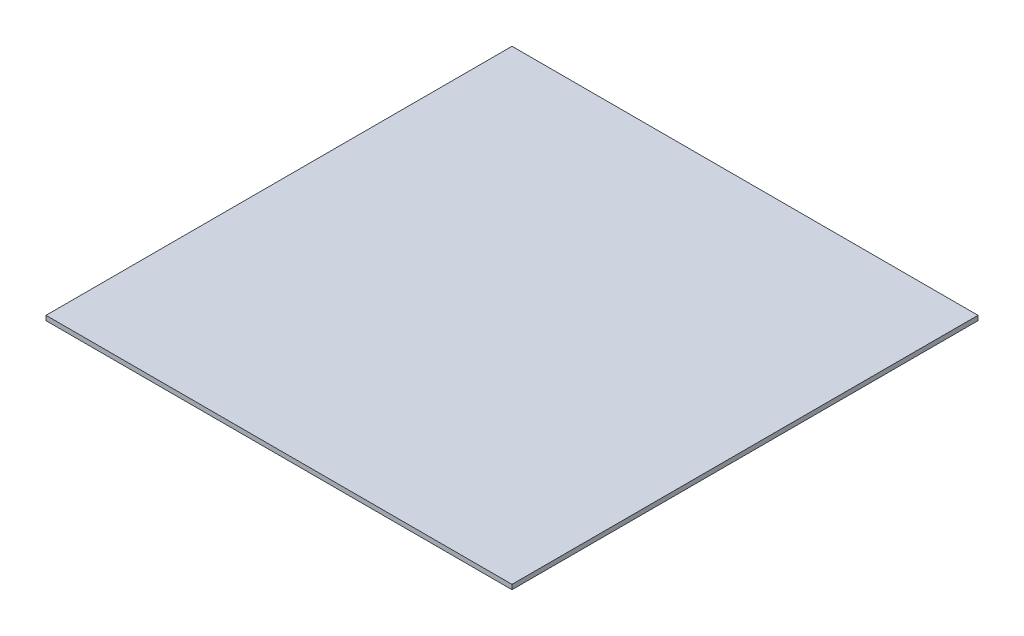
ISO-10303-21;
HEADER;
FILE_DESCRIPTION(('STEP AP214'),'2;1');
FILE_NAME('part.step','',(''),(''),'','','');
FILE_SCHEMA(('AUTOMOTIVE_DESIGN { 1 0 10303 214 1 1 1 1 }'));
ENDSEC;
DATA;
#1=APPLICATION_CONTEXT('core data for automotive mechanical design processes');
#2=APPLICATION_PROTOCOL_DEFINITION('international standard','automotive_design',2000,#1);
#3=PRODUCT_CONTEXT('',#1,'mechanical');
#4=PRODUCT('Part','Part','',(#3));
#5=PRODUCT_RELATED_PRODUCT_CATEGORY('part','',(#4));
#6=PRODUCT_DEFINITION_FORMATION('','',#4);
#7=PRODUCT_DEFINITION_CONTEXT('part definition',#1,'design');
#8=PRODUCT_DEFINITION('design','',#6,#7);
#9=PRODUCT_DEFINITION_SHAPE('','',#8);
#10=(LENGTH_UNIT() NAMED_UNIT(*) SI_UNIT(.MILLI.,.METRE.));
#11=(NAMED_UNIT(*) PLANE_ANGLE_UNIT() SI_UNIT($,.RADIAN.));
#12=(NAMED_UNIT(*) SI_UNIT($,.STERADIAN.) SOLID_ANGLE_UNIT());
#13=UNCERTAINTY_MEASURE_WITH_UNIT(LENGTH_MEASURE(1.E-05),#10,'distance_accuracy_value','');
#14=(GEOMETRIC_REPRESENTATION_CONTEXT(3) GLOBAL_UNCERTAINTY_ASSIGNED_CONTEXT((#13)) GLOBAL_UNIT_ASSIGNED_CONTEXT((#10,
#11,#12)) REPRESENTATION_CONTEXT('',''));
#15=CARTESIAN_POINT('',(0.,0.,0.));
#16=DIRECTION('',(0.,0.,1.));
#17=DIRECTION('',(1.,0.,0.));
#18=AXIS2_PLACEMENT_3D('',#15,#16,#17);
#19=CARTESIAN_POINT('',(1000.,20.,1000.));
#20=DIRECTION('',(-1.,0.,0.));
#21=DIRECTION('',(0.,0.,1.));
#22=AXIS2_PLACEMENT_3D('',#19,#20,#21);
#23=PLANE('',#22);
#24=DIRECTION('',(0.,0.,-1.));
#25=VECTOR('',#24,1.);
#26=CARTESIAN_POINT('',(1000.,0.,1000.));
#27=LINE('',#26,#25);
#28=CARTESIAN_POINT('',(1000.,0.,1000.));
#29=VERTEX_POINT('',#28);
#30=CARTESIAN_POINT('',(1000.,0.,-1000.));
#31=VERTEX_POINT('',#30);
#32=EDGE_CURVE('E96',#29,#31,#27,.T.);
#33=ORIENTED_EDGE('',*,*,#32,.T.);
#34=DIRECTION('',(0.,-1.,0.));
#35=VECTOR('',#34,1.);
#36=CARTESIAN_POINT('',(1000.,20.,-1000.));
#37=LINE('',#36,#35);
#38=CARTESIAN_POINT('',(1000.,20.,-1000.));
#39=VERTEX_POINT('',#38);
#40=EDGE_CURVE('E11',#39,#31,#37,.T.);
#41=ORIENTED_EDGE('',*,*,#40,.F.);
#42=DIRECTION('',(0.,0.,-1.));
#43=VECTOR('',#42,1.);
#44=CARTESIAN_POINT('',(1000.,20.,1000.));
#45=LINE('',#44,#43);
#46=CARTESIAN_POINT('',(1000.,20.,1000.));
#47=VERTEX_POINT('',#46);
#48=EDGE_CURVE('E84',#47,#39,#45,.T.);
#49=ORIENTED_EDGE('',*,*,#48,.F.);
#50=DIRECTION('',(0.,-1.,0.));
#51=VECTOR('',#50,1.);
#52=CARTESIAN_POINT('',(1000.,20.,1000.));
#53=LINE('',#52,#51);
#54=EDGE_CURVE('E92',#47,#29,#53,.T.);
#55=ORIENTED_EDGE('',*,*,#54,.T.);
#56=EDGE_LOOP('',(#33,#41,#49,#55));
#57=FACE_BOUND('',#56,.T.);
#58=ADVANCED_FACE('F33',(#57),#23,.F.);
#59=CARTESIAN_POINT('',(-1000.,20.,-1000.));
#60=DIRECTION('',(0.,0.,1.));
#61=DIRECTION('',(1.,0.,0.));
#62=AXIS2_PLACEMENT_3D('',#59,#60,#61);
#63=PLANE('',#62);
#64=DIRECTION('',(-1.,0.,0.));
#65=VECTOR('',#64,1.);
#66=CARTESIAN_POINT('',(-1000.,0.,-1000.));
#67=LINE('',#66,#65);
#68=CARTESIAN_POINT('',(-1000.,0.,-1000.));
#69=VERTEX_POINT('',#68);
#70=EDGE_CURVE('E88',#31,#69,#67,.T.);
#71=ORIENTED_EDGE('',*,*,#70,.T.);
#72=DIRECTION('',(0.,-1.,0.));
#73=VECTOR('',#72,1.);
#74=CARTESIAN_POINT('',(-1000.,20.,-1000.));
#75=LINE('',#74,#73);
#76=CARTESIAN_POINT('',(-1000.,20.,-1000.));
#77=VERTEX_POINT('',#76);
#78=EDGE_CURVE('E41',#77,#69,#75,.T.);
#79=ORIENTED_EDGE('',*,*,#78,.F.);
#80=DIRECTION('',(-1.,0.,0.));
#81=VECTOR('',#80,1.);
#82=CARTESIAN_POINT('',(-1000.,20.,-1000.));
#83=LINE('',#82,#81);
#84=EDGE_CURVE('E79',#39,#77,#83,.T.);
#85=ORIENTED_EDGE('',*,*,#84,.F.);
#86=ORIENTED_EDGE('',*,*,#40,.T.);
#87=EDGE_LOOP('',(#71,#79,#85,#86));
#88=FACE_BOUND('',#87,.T.);
#89=ADVANCED_FACE('F87',(#88),#63,.F.);
#90=CARTESIAN_POINT('',(-1000.,20.,1000.));
#91=DIRECTION('',(1.,0.,0.));
#92=DIRECTION('',(0.,0.,-1.));
#93=AXIS2_PLACEMENT_3D('',#90,#91,#92);
#94=PLANE('',#93);
#95=DIRECTION('',(0.,0.,1.));
#96=VECTOR('',#95,1.);
#97=CARTESIAN_POINT('',(-1000.,0.,1000.));
#98=LINE('',#97,#96);
#99=CARTESIAN_POINT('',(-1000.,0.,1000.));
#100=VERTEX_POINT('',#99);
#101=EDGE_CURVE('E66',#69,#100,#98,.T.);
#102=ORIENTED_EDGE('',*,*,#101,.T.);
#103=DIRECTION('',(0.,-1.,0.));
#104=VECTOR('',#103,1.);
#105=CARTESIAN_POINT('',(-1000.,20.,1000.));
#106=LINE('',#105,#104);
#107=CARTESIAN_POINT('',(-1000.,20.,1000.));
#108=VERTEX_POINT('',#107);
#109=EDGE_CURVE('E89',#108,#100,#106,.T.);
#110=ORIENTED_EDGE('',*,*,#109,.F.);
#111=DIRECTION('',(0.,0.,1.));
#112=VECTOR('',#111,1.);
#113=CARTESIAN_POINT('',(-1000.,20.,1000.));
#114=LINE('',#113,#112);
#115=EDGE_CURVE('E82',#77,#108,#114,.T.);
#116=ORIENTED_EDGE('',*,*,#115,.F.);
#117=ORIENTED_EDGE('',*,*,#78,.T.);
#118=EDGE_LOOP('',(#102,#110,#116,#117));
#119=FACE_BOUND('',#118,.T.);
#120=ADVANCED_FACE('F90',(#119),#94,.F.);
#121=CARTESIAN_POINT('',(-1000.,20.,1000.));
#122=DIRECTION('',(0.,0.,-1.));
#123=DIRECTION('',(-1.,0.,0.));
#124=AXIS2_PLACEMENT_3D('',#121,#122,#123);
#125=PLANE('',#124);
#126=DIRECTION('',(1.,0.,0.));
#127=VECTOR('',#126,1.);
#128=CARTESIAN_POINT('',(-1000.,0.,1000.));
#129=LINE('',#128,#127);
#130=EDGE_CURVE('E72',#100,#29,#129,.T.);
#131=ORIENTED_EDGE('',*,*,#130,.T.);
#132=ORIENTED_EDGE('',*,*,#54,.F.);
#133=DIRECTION('',(1.,0.,0.));
#134=VECTOR('',#133,1.);
#135=CARTESIAN_POINT('',(-1000.,20.,1000.));
#136=LINE('',#135,#134);
#137=EDGE_CURVE('E49',#108,#47,#136,.T.);
#138=ORIENTED_EDGE('',*,*,#137,.F.);
#139=ORIENTED_EDGE('',*,*,#109,.T.);
#140=EDGE_LOOP('',(#131,#132,#138,#139));
#141=FACE_BOUND('',#140,.T.);
#142=ADVANCED_FACE('F103',(#141),#125,.F.);
#143=CARTESIAN_POINT('',(0.,20.,0.));
#144=DIRECTION('',(0.,-1.,0.));
#145=DIRECTION('',(0.,0.,-1.));
#146=AXIS2_PLACEMENT_3D('',#143,#144,#145);
#147=PLANE('',#146);
#148=ORIENTED_EDGE('',*,*,#48,.T.);
#149=ORIENTED_EDGE('',*,*,#84,.T.);
#150=ORIENTED_EDGE('',*,*,#115,.T.);
#151=ORIENTED_EDGE('',*,*,#137,.T.);
#152=EDGE_LOOP('',(#148,#149,#150,#151));
#153=FACE_BOUND('',#152,.T.);
#154=ADVANCED_FACE('F80',(#153),#147,.F.);
#155=CARTESIAN_POINT('',(0.,0.,0.));
#156=DIRECTION('',(0.,-1.,0.));
#157=DIRECTION('',(0.,0.,-1.));
#158=AXIS2_PLACEMENT_3D('',#155,#156,#157);
#159=PLANE('',#158);
#160=ORIENTED_EDGE('',*,*,#32,.F.);
#161=ORIENTED_EDGE('',*,*,#130,.F.);
#162=ORIENTED_EDGE('',*,*,#101,.F.);
#163=ORIENTED_EDGE('',*,*,#70,.F.);
#164=EDGE_LOOP('',(#160,#161,#162,#163));
#165=FACE_BOUND('',#164,.T.);
#166=ADVANCED_FACE('F106',(#165),#159,.T.);
#167=CLOSED_SHELL('',(#58,#89,#120,#142,#154,#166));
#168=MANIFOLD_SOLID_BREP('B2',#167);
#169=ADVANCED_BREP_SHAPE_REPRESENTATION('',(#18,#168),#14);
#170=SHAPE_DEFINITION_REPRESENTATION(#9,#169);
ENDSEC;
END-ISO-10303-21;
